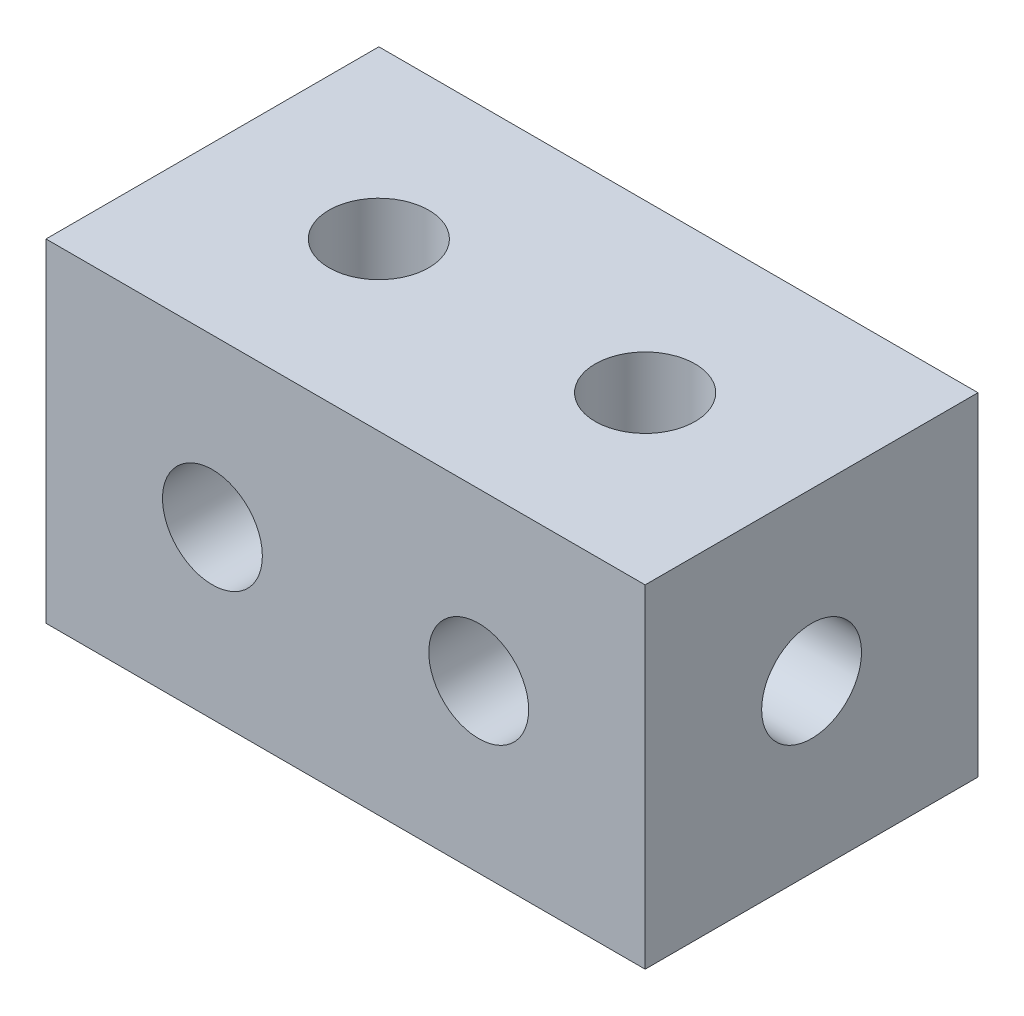
ISO-10303-21;
HEADER;
FILE_DESCRIPTION(('STEP AP214'),'2;1');
FILE_NAME('part.step','',(''),(''),'','','');
FILE_SCHEMA(('AUTOMOTIVE_DESIGN { 1 0 10303 214 1 1 1 1 }'));
ENDSEC;
DATA;
#1=APPLICATION_CONTEXT('core data for automotive mechanical design processes');
#2=APPLICATION_PROTOCOL_DEFINITION('international standard','automotive_design',2000,#1);
#3=PRODUCT_CONTEXT('',#1,'mechanical');
#4=PRODUCT('Part','Part','',(#3));
#5=PRODUCT_RELATED_PRODUCT_CATEGORY('part','',(#4));
#6=PRODUCT_DEFINITION_FORMATION('','',#4);
#7=PRODUCT_DEFINITION_CONTEXT('part definition',#1,'design');
#8=PRODUCT_DEFINITION('design','',#6,#7);
#9=PRODUCT_DEFINITION_SHAPE('','',#8);
#10=(LENGTH_UNIT() NAMED_UNIT(*) SI_UNIT(.MILLI.,.METRE.));
#11=(NAMED_UNIT(*) PLANE_ANGLE_UNIT() SI_UNIT($,.RADIAN.));
#12=(NAMED_UNIT(*) SI_UNIT($,.STERADIAN.) SOLID_ANGLE_UNIT());
#13=UNCERTAINTY_MEASURE_WITH_UNIT(LENGTH_MEASURE(1.E-05),#10,'distance_accuracy_value','');
#14=(GEOMETRIC_REPRESENTATION_CONTEXT(3) GLOBAL_UNCERTAINTY_ASSIGNED_CONTEXT((#13)) GLOBAL_UNIT_ASSIGNED_CONTEXT((#10,
#11,#12)) REPRESENTATION_CONTEXT('',''));
#15=CARTESIAN_POINT('',(0.,0.,0.));
#16=DIRECTION('',(0.,0.,1.));
#17=DIRECTION('',(1.,0.,0.));
#18=AXIS2_PLACEMENT_3D('',#15,#16,#17);
#19=CARTESIAN_POINT('',(4.00000000000001,10.,0.));
#20=DIRECTION('',(0.,-1.,0.));
#21=DIRECTION('',(0.,0.,-1.));
#22=AXIS2_PLACEMENT_3D('',#19,#20,#21);
#23=CYLINDRICAL_SURFACE('',#22,1.5);
#24=CARTESIAN_POINT('',(4.00000000000001,5.,0.));
#25=DIRECTION('',(-0.707106781186547,-0.707106781186547,0.));
#26=DIRECTION('',(0.707106781186547,-0.707106781186547,0.));
#27=AXIS2_PLACEMENT_3D('',#24,#25,#26);
#28=ELLIPSE('',#27,2.12132034355964,1.5);
#29=CARTESIAN_POINT('',(2.93933982822019,6.06066017177982,-1.06066017177982));
#30=VERTEX_POINT('',#29);
#31=CARTESIAN_POINT('',(2.93933982822019,6.06066017177982,1.06066017177982));
#32=VERTEX_POINT('',#31);
#33=EDGE_CURVE('E129',#30,#32,#28,.F.);
#34=ORIENTED_EDGE('',*,*,#33,.F.);
#35=CARTESIAN_POINT('',(4.00000000000001,5.,0.));
#36=DIRECTION('',(0.,-0.707106781186547,-0.707106781186547));
#37=DIRECTION('',(0.,-0.707106781186547,0.707106781186547));
#38=AXIS2_PLACEMENT_3D('',#35,#36,#37);
#39=ELLIPSE('',#38,2.12132034355964,1.5);
#40=CARTESIAN_POINT('',(5.06066017177983,6.06066017177982,-1.06066017177982));
#41=VERTEX_POINT('',#40);
#42=EDGE_CURVE('E148',#41,#30,#39,.F.);
#43=ORIENTED_EDGE('',*,*,#42,.F.);
#44=CARTESIAN_POINT('',(4.00000000000001,5.,0.));
#45=DIRECTION('',(0.707106781186547,-0.707106781186547,0.));
#46=DIRECTION('',(-0.707106781186547,-0.707106781186547,0.));
#47=AXIS2_PLACEMENT_3D('',#44,#45,#46);
#48=ELLIPSE('',#47,2.12132034355964,1.5);
#49=CARTESIAN_POINT('',(5.06066017177983,6.06066017177982,1.06066017177982));
#50=VERTEX_POINT('',#49);
#51=EDGE_CURVE('E160',#50,#41,#48,.F.);
#52=ORIENTED_EDGE('',*,*,#51,.F.);
#53=CARTESIAN_POINT('',(4.00000000000001,5.,0.));
#54=DIRECTION('',(0.,-0.707106781186547,0.707106781186547));
#55=DIRECTION('',(0.,-0.707106781186547,-0.707106781186547));
#56=AXIS2_PLACEMENT_3D('',#53,#54,#55);
#57=ELLIPSE('',#56,2.12132034355964,1.5);
#58=EDGE_CURVE('E134',#32,#50,#57,.F.);
#59=ORIENTED_EDGE('',*,*,#58,.F.);
#60=EDGE_LOOP('',(#34,#43,#52,#59));
#61=FACE_BOUND('',#60,.T.);
#62=CARTESIAN_POINT('',(4.00000000000001,10.,0.));
#63=DIRECTION('',(0.,1.,0.));
#64=DIRECTION('',(0.,0.,1.));
#65=AXIS2_PLACEMENT_3D('',#62,#63,#64);
#66=CIRCLE('',#65,1.5);
#67=CARTESIAN_POINT('',(4.00000000000001,10.,1.5));
#68=VERTEX_POINT('',#67);
#69=EDGE_CURVE('E203',#68,#68,#66,.T.);
#70=ORIENTED_EDGE('',*,*,#69,.T.);
#71=EDGE_LOOP('',(#70));
#72=FACE_BOUND('',#71,.T.);
#73=ADVANCED_FACE('F36',(#61,#72),#23,.F.);
#74=CARTESIAN_POINT('',(-4.00000000000001,10.,0.));
#75=DIRECTION('',(0.,-1.,0.));
#76=DIRECTION('',(0.,0.,-1.));
#77=AXIS2_PLACEMENT_3D('',#74,#75,#76);
#78=CYLINDRICAL_SURFACE('',#77,1.5);
#79=CARTESIAN_POINT('',(-4.00000000000001,5.,0.));
#80=DIRECTION('',(-0.707106781186547,-0.707106781186547,0.));
#81=DIRECTION('',(0.707106781186547,-0.707106781186547,0.));
#82=AXIS2_PLACEMENT_3D('',#79,#80,#81);
#83=ELLIPSE('',#82,2.12132034355964,1.5);
#84=CARTESIAN_POINT('',(-5.06066017177983,6.06066017177982,-1.06066017177982));
#85=VERTEX_POINT('',#84);
#86=CARTESIAN_POINT('',(-5.06066017177983,6.06066017177982,1.06066017177982));
#87=VERTEX_POINT('',#86);
#88=EDGE_CURVE('E59',#85,#87,#83,.F.);
#89=ORIENTED_EDGE('',*,*,#88,.F.);
#90=CARTESIAN_POINT('',(-4.00000000000001,5.,0.));
#91=DIRECTION('',(0.,-0.707106781186547,-0.707106781186547));
#92=DIRECTION('',(0.,-0.707106781186547,0.707106781186547));
#93=AXIS2_PLACEMENT_3D('',#90,#91,#92);
#94=ELLIPSE('',#93,2.12132034355964,1.5);
#95=CARTESIAN_POINT('',(-2.93933982822019,6.06066017177982,-1.06066017177982));
#96=VERTEX_POINT('',#95);
#97=EDGE_CURVE('E244',#96,#85,#94,.F.);
#98=ORIENTED_EDGE('',*,*,#97,.F.);
#99=CARTESIAN_POINT('',(-4.00000000000001,5.,0.));
#100=DIRECTION('',(0.707106781186547,-0.707106781186547,0.));
#101=DIRECTION('',(-0.707106781186547,-0.707106781186547,0.));
#102=AXIS2_PLACEMENT_3D('',#99,#100,#101);
#103=ELLIPSE('',#102,2.12132034355964,1.5);
#104=CARTESIAN_POINT('',(-2.93933982822018,6.06066017177982,1.06066017177982));
#105=VERTEX_POINT('',#104);
#106=EDGE_CURVE('E182',#105,#96,#103,.F.);
#107=ORIENTED_EDGE('',*,*,#106,.F.);
#108=CARTESIAN_POINT('',(-4.00000000000001,5.,0.));
#109=DIRECTION('',(0.,-0.707106781186547,0.707106781186547));
#110=DIRECTION('',(0.,-0.707106781186547,-0.707106781186547));
#111=AXIS2_PLACEMENT_3D('',#108,#109,#110);
#112=ELLIPSE('',#111,2.12132034355964,1.5);
#113=EDGE_CURVE('E152',#87,#105,#112,.F.);
#114=ORIENTED_EDGE('',*,*,#113,.F.);
#115=EDGE_LOOP('',(#89,#98,#107,#114));
#116=FACE_BOUND('',#115,.T.);
#117=CARTESIAN_POINT('',(-4.00000000000001,10.,0.));
#118=DIRECTION('',(0.,1.,0.));
#119=DIRECTION('',(0.,0.,1.));
#120=AXIS2_PLACEMENT_3D('',#117,#118,#119);
#121=CIRCLE('',#120,1.5);
#122=CARTESIAN_POINT('',(-4.00000000000001,10.,1.5));
#123=VERTEX_POINT('',#122);
#124=EDGE_CURVE('E209',#123,#123,#121,.T.);
#125=ORIENTED_EDGE('',*,*,#124,.T.);
#126=EDGE_LOOP('',(#125));
#127=FACE_BOUND('',#126,.T.);
#128=ADVANCED_FACE('F260',(#116,#127),#78,.F.);
#129=CARTESIAN_POINT('',(0.,10.,0.));
#130=DIRECTION('',(0.,1.,0.));
#131=DIRECTION('',(0.,0.,1.));
#132=AXIS2_PLACEMENT_3D('',#129,#130,#131);
#133=PLANE('',#132);
#134=ORIENTED_EDGE('',*,*,#124,.F.);
#135=EDGE_LOOP('',(#134));
#136=FACE_BOUND('',#135,.T.);
#137=DIRECTION('',(0.,0.,-1.));
#138=VECTOR('',#137,1.);
#139=CARTESIAN_POINT('',(9.00000000000001,10.,-5.));
#140=LINE('',#139,#138);
#141=CARTESIAN_POINT('',(9.00000000000001,10.,5.));
#142=VERTEX_POINT('',#141);
#143=CARTESIAN_POINT('',(9.00000000000001,10.,-5.));
#144=VERTEX_POINT('',#143);
#145=EDGE_CURVE('E215',#142,#144,#140,.T.);
#146=ORIENTED_EDGE('',*,*,#145,.T.);
#147=DIRECTION('',(-1.,0.,0.));
#148=VECTOR('',#147,1.);
#149=CARTESIAN_POINT('',(-9.00000000000001,10.,-5.));
#150=LINE('',#149,#148);
#151=CARTESIAN_POINT('',(-9.00000000000001,10.,-5.));
#152=VERTEX_POINT('',#151);
#153=EDGE_CURVE('E218',#144,#152,#150,.T.);
#154=ORIENTED_EDGE('',*,*,#153,.T.);
#155=DIRECTION('',(0.,0.,1.));
#156=VECTOR('',#155,1.);
#157=CARTESIAN_POINT('',(-9.00000000000001,10.,-5.));
#158=LINE('',#157,#156);
#159=CARTESIAN_POINT('',(-9.00000000000001,10.,5.));
#160=VERTEX_POINT('',#159);
#161=EDGE_CURVE('E221',#152,#160,#158,.T.);
#162=ORIENTED_EDGE('',*,*,#161,.T.);
#163=DIRECTION('',(1.,0.,0.));
#164=VECTOR('',#163,1.);
#165=CARTESIAN_POINT('',(-9.00000000000001,10.,5.));
#166=LINE('',#165,#164);
#167=EDGE_CURVE('E223',#160,#142,#166,.T.);
#168=ORIENTED_EDGE('',*,*,#167,.T.);
#169=EDGE_LOOP('',(#146,#154,#162,#168));
#170=FACE_BOUND('',#169,.T.);
#171=ORIENTED_EDGE('',*,*,#69,.F.);
#172=EDGE_LOOP('',(#171));
#173=FACE_BOUND('',#172,.T.);
#174=ADVANCED_FACE('F287',(#136,#170,#173),#133,.T.);
#175=CARTESIAN_POINT('',(0.,0.,0.));
#176=DIRECTION('',(0.,1.,0.));
#177=DIRECTION('',(0.,0.,1.));
#178=AXIS2_PLACEMENT_3D('',#175,#176,#177);
#179=PLANE('',#178);
#180=DIRECTION('',(0.,0.,-1.));
#181=VECTOR('',#180,1.);
#182=CARTESIAN_POINT('',(9.00000000000001,0.,-5.));
#183=LINE('',#182,#181);
#184=CARTESIAN_POINT('',(9.00000000000001,0.,5.));
#185=VERTEX_POINT('',#184);
#186=CARTESIAN_POINT('',(9.00000000000001,0.,-5.));
#187=VERTEX_POINT('',#186);
#188=EDGE_CURVE('E212',#185,#187,#183,.T.);
#189=ORIENTED_EDGE('',*,*,#188,.F.);
#190=DIRECTION('',(1.,0.,0.));
#191=VECTOR('',#190,1.);
#192=CARTESIAN_POINT('',(-9.00000000000001,0.,5.));
#193=LINE('',#192,#191);
#194=CARTESIAN_POINT('',(-9.00000000000001,0.,5.));
#195=VERTEX_POINT('',#194);
#196=EDGE_CURVE('E219',#195,#185,#193,.T.);
#197=ORIENTED_EDGE('',*,*,#196,.F.);
#198=DIRECTION('',(0.,0.,1.));
#199=VECTOR('',#198,1.);
#200=CARTESIAN_POINT('',(-9.00000000000001,0.,-5.));
#201=LINE('',#200,#199);
#202=CARTESIAN_POINT('',(-9.00000000000001,0.,-5.));
#203=VERTEX_POINT('',#202);
#204=EDGE_CURVE('E230',#203,#195,#201,.T.);
#205=ORIENTED_EDGE('',*,*,#204,.F.);
#206=DIRECTION('',(-1.,0.,0.));
#207=VECTOR('',#206,1.);
#208=CARTESIAN_POINT('',(-9.00000000000001,0.,-5.));
#209=LINE('',#208,#207);
#210=EDGE_CURVE('E228',#187,#203,#209,.T.);
#211=ORIENTED_EDGE('',*,*,#210,.F.);
#212=EDGE_LOOP('',(#189,#197,#205,#211));
#213=FACE_BOUND('',#212,.T.);
#214=CARTESIAN_POINT('',(-4.00000000000001,0.,0.));
#215=DIRECTION('',(0.,1.,0.));
#216=DIRECTION('',(0.,0.,1.));
#217=AXIS2_PLACEMENT_3D('',#214,#215,#216);
#218=CIRCLE('',#217,1.5);
#219=CARTESIAN_POINT('',(-4.00000000000001,0.,1.5));
#220=VERTEX_POINT('',#219);
#221=EDGE_CURVE('E206',#220,#220,#218,.T.);
#222=ORIENTED_EDGE('',*,*,#221,.T.);
#223=EDGE_LOOP('',(#222));
#224=FACE_BOUND('',#223,.T.);
#225=CARTESIAN_POINT('',(4.00000000000001,0.,0.));
#226=DIRECTION('',(0.,1.,0.));
#227=DIRECTION('',(0.,0.,1.));
#228=AXIS2_PLACEMENT_3D('',#225,#226,#227);
#229=CIRCLE('',#228,1.5);
#230=CARTESIAN_POINT('',(4.00000000000001,0.,1.5));
#231=VERTEX_POINT('',#230);
#232=EDGE_CURVE('E200',#231,#231,#229,.T.);
#233=ORIENTED_EDGE('',*,*,#232,.T.);
#234=EDGE_LOOP('',(#233));
#235=FACE_BOUND('',#234,.T.);
#236=ADVANCED_FACE('F305',(#213,#224,#235),#179,.F.);
#237=CARTESIAN_POINT('',(9.00000000000001,10.,-5.));
#238=DIRECTION('',(-1.,0.,0.));
#239=DIRECTION('',(0.,0.,1.));
#240=AXIS2_PLACEMENT_3D('',#237,#238,#239);
#241=PLANE('',#240);
#242=CARTESIAN_POINT('',(9.00000000000001,5.,0.));
#243=DIRECTION('',(-1.,0.,0.));
#244=DIRECTION('',(0.,0.,1.));
#245=AXIS2_PLACEMENT_3D('',#242,#243,#244);
#246=CIRCLE('',#245,1.5);
#247=CARTESIAN_POINT('',(9.00000000000001,5.,1.5));
#248=VERTEX_POINT('',#247);
#249=EDGE_CURVE('E187',#248,#248,#246,.T.);
#250=ORIENTED_EDGE('',*,*,#249,.T.);
#251=EDGE_LOOP('',(#250));
#252=FACE_BOUND('',#251,.T.);
#253=ORIENTED_EDGE('',*,*,#188,.T.);
#254=DIRECTION('',(0.,-1.,0.));
#255=VECTOR('',#254,1.);
#256=CARTESIAN_POINT('',(9.00000000000001,10.,-5.));
#257=LINE('',#256,#255);
#258=EDGE_CURVE('E241',#144,#187,#257,.T.);
#259=ORIENTED_EDGE('',*,*,#258,.F.);
#260=ORIENTED_EDGE('',*,*,#145,.F.);
#261=DIRECTION('',(0.,-1.,0.));
#262=VECTOR('',#261,1.);
#263=CARTESIAN_POINT('',(9.00000000000001,10.,5.));
#264=LINE('',#263,#262);
#265=EDGE_CURVE('E225',#142,#185,#264,.T.);
#266=ORIENTED_EDGE('',*,*,#265,.T.);
#267=EDGE_LOOP('',(#253,#259,#260,#266));
#268=FACE_BOUND('',#267,.T.);
#269=ADVANCED_FACE('F38',(#252,#268),#241,.F.);
#270=CARTESIAN_POINT('',(-9.00000000000001,10.,-5.));
#271=DIRECTION('',(0.,0.,1.));
#272=DIRECTION('',(1.,0.,0.));
#273=AXIS2_PLACEMENT_3D('',#270,#271,#272);
#274=PLANE('',#273);
#275=CARTESIAN_POINT('',(4.00000000000001,5.,-5.));
#276=DIRECTION('',(0.,0.,1.));
#277=DIRECTION('',(1.,0.,0.));
#278=AXIS2_PLACEMENT_3D('',#275,#276,#277);
#279=CIRCLE('',#278,1.5);
#280=CARTESIAN_POINT('',(5.50000000000001,5.,-5.));
#281=VERTEX_POINT('',#280);
#282=EDGE_CURVE('E191',#281,#281,#279,.T.);
#283=ORIENTED_EDGE('',*,*,#282,.T.);
#284=EDGE_LOOP('',(#283));
#285=FACE_BOUND('',#284,.T.);
#286=CARTESIAN_POINT('',(-4.00000000000001,5.,-5.));
#287=DIRECTION('',(0.,0.,1.));
#288=DIRECTION('',(1.,0.,0.));
#289=AXIS2_PLACEMENT_3D('',#286,#287,#288);
#290=CIRCLE('',#289,1.5);
#291=CARTESIAN_POINT('',(-2.50000000000001,5.,-5.));
#292=VERTEX_POINT('',#291);
#293=EDGE_CURVE('E197',#292,#292,#290,.T.);
#294=ORIENTED_EDGE('',*,*,#293,.T.);
#295=EDGE_LOOP('',(#294));
#296=FACE_BOUND('',#295,.T.);
#297=ORIENTED_EDGE('',*,*,#210,.T.);
#298=DIRECTION('',(0.,-1.,0.));
#299=VECTOR('',#298,1.);
#300=CARTESIAN_POINT('',(-9.00000000000001,10.,-5.));
#301=LINE('',#300,#299);
#302=EDGE_CURVE('E238',#152,#203,#301,.T.);
#303=ORIENTED_EDGE('',*,*,#302,.F.);
#304=ORIENTED_EDGE('',*,*,#153,.F.);
#305=ORIENTED_EDGE('',*,*,#258,.T.);
#306=EDGE_LOOP('',(#297,#303,#304,#305));
#307=FACE_BOUND('',#306,.T.);
#308=ADVANCED_FACE('F311',(#285,#296,#307),#274,.F.);
#309=CARTESIAN_POINT('',(-9.00000000000001,10.,-5.));
#310=DIRECTION('',(1.,0.,0.));
#311=DIRECTION('',(0.,0.,-1.));
#312=AXIS2_PLACEMENT_3D('',#309,#310,#311);
#313=PLANE('',#312);
#314=CARTESIAN_POINT('',(-9.00000000000001,5.,0.));
#315=DIRECTION('',(-1.,0.,0.));
#316=DIRECTION('',(0.,0.,1.));
#317=AXIS2_PLACEMENT_3D('',#314,#315,#316);
#318=CIRCLE('',#317,1.5);
#319=CARTESIAN_POINT('',(-9.00000000000001,5.,1.5));
#320=VERTEX_POINT('',#319);
#321=EDGE_CURVE('E144',#320,#320,#318,.T.);
#322=ORIENTED_EDGE('',*,*,#321,.F.);
#323=EDGE_LOOP('',(#322));
#324=FACE_BOUND('',#323,.T.);
#325=ORIENTED_EDGE('',*,*,#204,.T.);
#326=DIRECTION('',(0.,-1.,0.));
#327=VECTOR('',#326,1.);
#328=CARTESIAN_POINT('',(-9.00000000000001,10.,5.));
#329=LINE('',#328,#327);
#330=EDGE_CURVE('E235',#160,#195,#329,.T.);
#331=ORIENTED_EDGE('',*,*,#330,.F.);
#332=ORIENTED_EDGE('',*,*,#161,.F.);
#333=ORIENTED_EDGE('',*,*,#302,.T.);
#334=EDGE_LOOP('',(#325,#331,#332,#333));
#335=FACE_BOUND('',#334,.T.);
#336=ADVANCED_FACE('F299',(#324,#335),#313,.F.);
#337=CARTESIAN_POINT('',(-9.00000000000001,10.,5.));
#338=DIRECTION('',(0.,0.,-1.));
#339=DIRECTION('',(-1.,0.,0.));
#340=AXIS2_PLACEMENT_3D('',#337,#338,#339);
#341=PLANE('',#340);
#342=CARTESIAN_POINT('',(4.00000000000001,5.,5.));
#343=DIRECTION('',(0.,0.,1.));
#344=DIRECTION('',(1.,0.,0.));
#345=AXIS2_PLACEMENT_3D('',#342,#343,#344);
#346=CIRCLE('',#345,1.5);
#347=CARTESIAN_POINT('',(5.50000000000001,5.,5.));
#348=VERTEX_POINT('',#347);
#349=EDGE_CURVE('E190',#348,#348,#346,.T.);
#350=ORIENTED_EDGE('',*,*,#349,.F.);
#351=EDGE_LOOP('',(#350));
#352=FACE_BOUND('',#351,.T.);
#353=CARTESIAN_POINT('',(-4.00000000000001,5.,5.));
#354=DIRECTION('',(0.,0.,1.));
#355=DIRECTION('',(1.,0.,0.));
#356=AXIS2_PLACEMENT_3D('',#353,#354,#355);
#357=CIRCLE('',#356,1.5);
#358=CARTESIAN_POINT('',(-2.50000000000001,5.,5.));
#359=VERTEX_POINT('',#358);
#360=EDGE_CURVE('E194',#359,#359,#357,.T.);
#361=ORIENTED_EDGE('',*,*,#360,.F.);
#362=EDGE_LOOP('',(#361));
#363=FACE_BOUND('',#362,.T.);
#364=ORIENTED_EDGE('',*,*,#196,.T.);
#365=ORIENTED_EDGE('',*,*,#265,.F.);
#366=ORIENTED_EDGE('',*,*,#167,.F.);
#367=ORIENTED_EDGE('',*,*,#330,.T.);
#368=EDGE_LOOP('',(#364,#365,#366,#367));
#369=FACE_BOUND('',#368,.T.);
#370=ADVANCED_FACE('F295',(#352,#363,#369),#341,.F.);
#371=CARTESIAN_POINT('',(-4.00000000000001,5.,0.));
#372=DIRECTION('',(-0.707106781186547,-0.707106781186547,0.));
#373=DIRECTION('',(0.707106781186547,-0.707106781186547,0.));
#374=AXIS2_PLACEMENT_3D('',#371,#372,#373);
#375=ELLIPSE('',#374,2.12132034355964,1.5);
#376=CARTESIAN_POINT('',(-2.93933982822019,3.93933982822018,-1.06066017177982));
#377=VERTEX_POINT('',#376);
#378=CARTESIAN_POINT('',(-2.93933982822018,3.93933982822018,1.06066017177982));
#379=VERTEX_POINT('',#378);
#380=EDGE_CURVE('E51',#377,#379,#375,.T.);
#381=ORIENTED_EDGE('',*,*,#380,.F.);
#382=CARTESIAN_POINT('',(-4.00000000000001,5.,0.));
#383=DIRECTION('',(0.,-0.707106781186547,0.707106781186547));
#384=DIRECTION('',(0.,-0.707106781186547,-0.707106781186547));
#385=AXIS2_PLACEMENT_3D('',#382,#383,#384);
#386=ELLIPSE('',#385,2.12132034355964,1.5);
#387=CARTESIAN_POINT('',(-5.06066017177983,3.93933982822018,-1.06066017177982));
#388=VERTEX_POINT('',#387);
#389=EDGE_CURVE('E250',#388,#377,#386,.T.);
#390=ORIENTED_EDGE('',*,*,#389,.F.);
#391=CARTESIAN_POINT('',(-4.00000000000001,5.,0.));
#392=DIRECTION('',(0.707106781186547,-0.707106781186547,0.));
#393=DIRECTION('',(-0.707106781186547,-0.707106781186547,0.));
#394=AXIS2_PLACEMENT_3D('',#391,#392,#393);
#395=ELLIPSE('',#394,2.12132034355964,1.5);
#396=CARTESIAN_POINT('',(-5.06066017177983,3.93933982822018,1.06066017177982));
#397=VERTEX_POINT('',#396);
#398=EDGE_CURVE('E173',#397,#388,#395,.T.);
#399=ORIENTED_EDGE('',*,*,#398,.F.);
#400=CARTESIAN_POINT('',(-4.00000000000001,5.,0.));
#401=DIRECTION('',(0.,-0.707106781186547,-0.707106781186547));
#402=DIRECTION('',(0.,-0.707106781186547,0.707106781186547));
#403=AXIS2_PLACEMENT_3D('',#400,#401,#402);
#404=ELLIPSE('',#403,2.12132034355964,1.5);
#405=EDGE_CURVE('E247',#379,#397,#404,.T.);
#406=ORIENTED_EDGE('',*,*,#405,.F.);
#407=EDGE_LOOP('',(#381,#390,#399,#406));
#408=FACE_BOUND('',#407,.T.);
#409=ORIENTED_EDGE('',*,*,#221,.F.);
#410=EDGE_LOOP('',(#409));
#411=FACE_BOUND('',#410,.T.);
#412=ADVANCED_FACE('F269',(#408,#411),#78,.F.);
#413=CARTESIAN_POINT('',(4.00000000000001,5.,0.));
#414=DIRECTION('',(-0.707106781186547,-0.707106781186547,0.));
#415=DIRECTION('',(0.707106781186547,-0.707106781186547,0.));
#416=AXIS2_PLACEMENT_3D('',#413,#414,#415);
#417=ELLIPSE('',#416,2.12132034355964,1.5);
#418=CARTESIAN_POINT('',(5.06066017177983,3.93933982822018,-1.06066017177982));
#419=VERTEX_POINT('',#418);
#420=CARTESIAN_POINT('',(5.06066017177983,3.93933982822018,1.06066017177982));
#421=VERTEX_POINT('',#420);
#422=EDGE_CURVE('E164',#419,#421,#417,.T.);
#423=ORIENTED_EDGE('',*,*,#422,.F.);
#424=CARTESIAN_POINT('',(4.00000000000001,5.,0.));
#425=DIRECTION('',(0.,-0.707106781186547,0.707106781186547));
#426=DIRECTION('',(0.,-0.707106781186547,-0.707106781186547));
#427=AXIS2_PLACEMENT_3D('',#424,#425,#426);
#428=ELLIPSE('',#427,2.12132034355964,1.5);
#429=CARTESIAN_POINT('',(2.93933982822019,3.93933982822018,-1.06066017177982));
#430=VERTEX_POINT('',#429);
#431=EDGE_CURVE('E143',#430,#419,#428,.T.);
#432=ORIENTED_EDGE('',*,*,#431,.F.);
#433=CARTESIAN_POINT('',(4.00000000000001,5.,0.));
#434=DIRECTION('',(0.707106781186547,-0.707106781186547,0.));
#435=DIRECTION('',(-0.707106781186547,-0.707106781186547,0.));
#436=AXIS2_PLACEMENT_3D('',#433,#434,#435);
#437=ELLIPSE('',#436,2.12132034355964,1.5);
#438=CARTESIAN_POINT('',(2.93933982822019,3.93933982822018,1.06066017177982));
#439=VERTEX_POINT('',#438);
#440=EDGE_CURVE('E126',#439,#430,#437,.T.);
#441=ORIENTED_EDGE('',*,*,#440,.F.);
#442=CARTESIAN_POINT('',(4.00000000000001,5.,0.));
#443=DIRECTION('',(0.,-0.707106781186547,-0.707106781186547));
#444=DIRECTION('',(0.,-0.707106781186547,0.707106781186547));
#445=AXIS2_PLACEMENT_3D('',#442,#443,#444);
#446=ELLIPSE('',#445,2.12132034355964,1.5);
#447=EDGE_CURVE('E141',#421,#439,#446,.T.);
#448=ORIENTED_EDGE('',*,*,#447,.F.);
#449=EDGE_LOOP('',(#423,#432,#441,#448));
#450=FACE_BOUND('',#449,.T.);
#451=ORIENTED_EDGE('',*,*,#232,.F.);
#452=EDGE_LOOP('',(#451));
#453=FACE_BOUND('',#452,.T.);
#454=ADVANCED_FACE('F139',(#450,#453),#23,.F.);
#455=CARTESIAN_POINT('',(-4.00000000000001,5.,-5.));
#456=DIRECTION('',(0.,0.,1.));
#457=DIRECTION('',(1.,0.,0.));
#458=AXIS2_PLACEMENT_3D('',#455,#456,#457);
#459=CYLINDRICAL_SURFACE('',#458,1.5);
#460=ORIENTED_EDGE('',*,*,#97,.T.);
#461=CARTESIAN_POINT('',(-4.00000000000001,5.,0.));
#462=DIRECTION('',(-0.707106781186547,0.,0.707106781186548));
#463=DIRECTION('',(0.707106781186548,0.,0.707106781186547));
#464=AXIS2_PLACEMENT_3D('',#461,#462,#463);
#465=ELLIPSE('',#464,2.12132034355964,1.5);
#466=EDGE_CURVE('E176',#85,#388,#465,.T.);
#467=ORIENTED_EDGE('',*,*,#466,.T.);
#468=ORIENTED_EDGE('',*,*,#389,.T.);
#469=CARTESIAN_POINT('',(-4.00000000000001,5.,0.));
#470=DIRECTION('',(0.707106781186548,0.,0.707106781186547));
#471=DIRECTION('',(-0.707106781186547,0.,0.707106781186548));
#472=AXIS2_PLACEMENT_3D('',#469,#470,#471);
#473=ELLIPSE('',#472,2.12132034355964,1.5);
#474=EDGE_CURVE('E184',#377,#96,#473,.T.);
#475=ORIENTED_EDGE('',*,*,#474,.T.);
#476=EDGE_LOOP('',(#460,#467,#468,#475));
#477=FACE_BOUND('',#476,.T.);
#478=ORIENTED_EDGE('',*,*,#293,.F.);
#479=EDGE_LOOP('',(#478));
#480=FACE_BOUND('',#479,.T.);
#481=ADVANCED_FACE('F264',(#477,#480),#459,.F.);
#482=ORIENTED_EDGE('',*,*,#113,.T.);
#483=CARTESIAN_POINT('',(-4.00000000000001,5.,0.));
#484=DIRECTION('',(-0.707106781186547,0.,0.707106781186548));
#485=DIRECTION('',(0.707106781186548,0.,0.707106781186547));
#486=AXIS2_PLACEMENT_3D('',#483,#484,#485);
#487=ELLIPSE('',#486,2.12132034355964,1.5);
#488=EDGE_CURVE('E179',#105,#379,#487,.F.);
#489=ORIENTED_EDGE('',*,*,#488,.T.);
#490=ORIENTED_EDGE('',*,*,#405,.T.);
#491=CARTESIAN_POINT('',(-4.00000000000001,5.,0.));
#492=DIRECTION('',(0.707106781186548,0.,0.707106781186547));
#493=DIRECTION('',(-0.707106781186547,0.,0.707106781186548));
#494=AXIS2_PLACEMENT_3D('',#491,#492,#493);
#495=ELLIPSE('',#494,2.12132034355964,1.5);
#496=EDGE_CURVE('E166',#397,#87,#495,.F.);
#497=ORIENTED_EDGE('',*,*,#496,.T.);
#498=EDGE_LOOP('',(#482,#489,#490,#497));
#499=FACE_BOUND('',#498,.T.);
#500=ORIENTED_EDGE('',*,*,#360,.T.);
#501=EDGE_LOOP('',(#500));
#502=FACE_BOUND('',#501,.T.);
#503=ADVANCED_FACE('F255',(#499,#502),#459,.F.);
#504=CARTESIAN_POINT('',(4.00000000000001,5.,-5.));
#505=DIRECTION('',(0.,0.,1.));
#506=DIRECTION('',(1.,0.,0.));
#507=AXIS2_PLACEMENT_3D('',#504,#505,#506);
#508=CYLINDRICAL_SURFACE('',#507,1.5);
#509=ORIENTED_EDGE('',*,*,#42,.T.);
#510=CARTESIAN_POINT('',(4.00000000000001,5.,0.));
#511=DIRECTION('',(-0.707106781186547,0.,0.707106781186548));
#512=DIRECTION('',(0.707106781186548,0.,0.707106781186547));
#513=AXIS2_PLACEMENT_3D('',#510,#511,#512);
#514=ELLIPSE('',#513,2.12132034355964,1.5);
#515=EDGE_CURVE('E168',#30,#430,#514,.T.);
#516=ORIENTED_EDGE('',*,*,#515,.T.);
#517=ORIENTED_EDGE('',*,*,#431,.T.);
#518=CARTESIAN_POINT('',(4.00000000000001,5.,0.));
#519=DIRECTION('',(0.707106781186548,0.,0.707106781186547));
#520=DIRECTION('',(-0.707106781186547,0.,0.707106781186548));
#521=AXIS2_PLACEMENT_3D('',#518,#519,#520);
#522=ELLIPSE('',#521,2.12132034355964,1.5);
#523=EDGE_CURVE('E163',#419,#41,#522,.T.);
#524=ORIENTED_EDGE('',*,*,#523,.T.);
#525=EDGE_LOOP('',(#509,#516,#517,#524));
#526=FACE_BOUND('',#525,.T.);
#527=ORIENTED_EDGE('',*,*,#282,.F.);
#528=EDGE_LOOP('',(#527));
#529=FACE_BOUND('',#528,.T.);
#530=ADVANCED_FACE('F344',(#526,#529),#508,.F.);
#531=ORIENTED_EDGE('',*,*,#58,.T.);
#532=CARTESIAN_POINT('',(4.00000000000001,5.,0.));
#533=DIRECTION('',(-0.707106781186547,0.,0.707106781186548));
#534=DIRECTION('',(0.707106781186548,0.,0.707106781186547));
#535=AXIS2_PLACEMENT_3D('',#532,#533,#534);
#536=ELLIPSE('',#535,2.12132034355964,1.5);
#537=EDGE_CURVE('E11',#50,#421,#536,.F.);
#538=ORIENTED_EDGE('',*,*,#537,.T.);
#539=ORIENTED_EDGE('',*,*,#447,.T.);
#540=CARTESIAN_POINT('',(4.00000000000001,5.,0.));
#541=DIRECTION('',(0.707106781186548,0.,0.707106781186547));
#542=DIRECTION('',(-0.707106781186547,0.,0.707106781186548));
#543=AXIS2_PLACEMENT_3D('',#540,#541,#542);
#544=ELLIPSE('',#543,2.12132034355964,1.5);
#545=EDGE_CURVE('E44',#439,#32,#544,.F.);
#546=ORIENTED_EDGE('',*,*,#545,.T.);
#547=EDGE_LOOP('',(#531,#538,#539,#546));
#548=FACE_BOUND('',#547,.T.);
#549=ORIENTED_EDGE('',*,*,#349,.T.);
#550=EDGE_LOOP('',(#549));
#551=FACE_BOUND('',#550,.T.);
#552=ADVANCED_FACE('F146',(#548,#551),#508,.F.);
#553=CARTESIAN_POINT('',(16.,5.,0.));
#554=DIRECTION('',(-1.,0.,0.));
#555=DIRECTION('',(0.,0.,1.));
#556=AXIS2_PLACEMENT_3D('',#553,#554,#555);
#557=CYLINDRICAL_SURFACE('',#556,1.5);
#558=ORIENTED_EDGE('',*,*,#33,.T.);
#559=ORIENTED_EDGE('',*,*,#545,.F.);
#560=ORIENTED_EDGE('',*,*,#440,.T.);
#561=ORIENTED_EDGE('',*,*,#515,.F.);
#562=EDGE_LOOP('',(#558,#559,#560,#561));
#563=FACE_BOUND('',#562,.T.);
#564=ORIENTED_EDGE('',*,*,#380,.T.);
#565=ORIENTED_EDGE('',*,*,#488,.F.);
#566=ORIENTED_EDGE('',*,*,#106,.T.);
#567=ORIENTED_EDGE('',*,*,#474,.F.);
#568=EDGE_LOOP('',(#564,#565,#566,#567));
#569=FACE_BOUND('',#568,.T.);
#570=ADVANCED_FACE('F125',(#563,#569),#557,.F.);
#571=ORIENTED_EDGE('',*,*,#422,.T.);
#572=ORIENTED_EDGE('',*,*,#537,.F.);
#573=ORIENTED_EDGE('',*,*,#51,.T.);
#574=ORIENTED_EDGE('',*,*,#523,.F.);
#575=EDGE_LOOP('',(#571,#572,#573,#574));
#576=FACE_BOUND('',#575,.T.);
#577=ORIENTED_EDGE('',*,*,#249,.F.);
#578=EDGE_LOOP('',(#577));
#579=FACE_BOUND('',#578,.T.);
#580=ADVANCED_FACE('F273',(#576,#579),#557,.F.);
#581=ORIENTED_EDGE('',*,*,#321,.T.);
#582=EDGE_LOOP('',(#581));
#583=FACE_BOUND('',#582,.T.);
#584=ORIENTED_EDGE('',*,*,#88,.T.);
#585=ORIENTED_EDGE('',*,*,#496,.F.);
#586=ORIENTED_EDGE('',*,*,#398,.T.);
#587=ORIENTED_EDGE('',*,*,#466,.F.);
#588=EDGE_LOOP('',(#584,#585,#586,#587));
#589=FACE_BOUND('',#588,.T.);
#590=ADVANCED_FACE('F271',(#583,#589),#557,.F.);
#591=CLOSED_SHELL('',(#73,#128,#174,#236,#269,#308,#336,#370,#412,#454,#481,#503,#530,#552,#570,
#580,#590));
#592=MANIFOLD_SOLID_BREP('B2',#591);
#593=ADVANCED_BREP_SHAPE_REPRESENTATION('',(#18,#592),#14);
#594=SHAPE_DEFINITION_REPRESENTATION(#9,#593);
ENDSEC;
END-ISO-10303-21;
